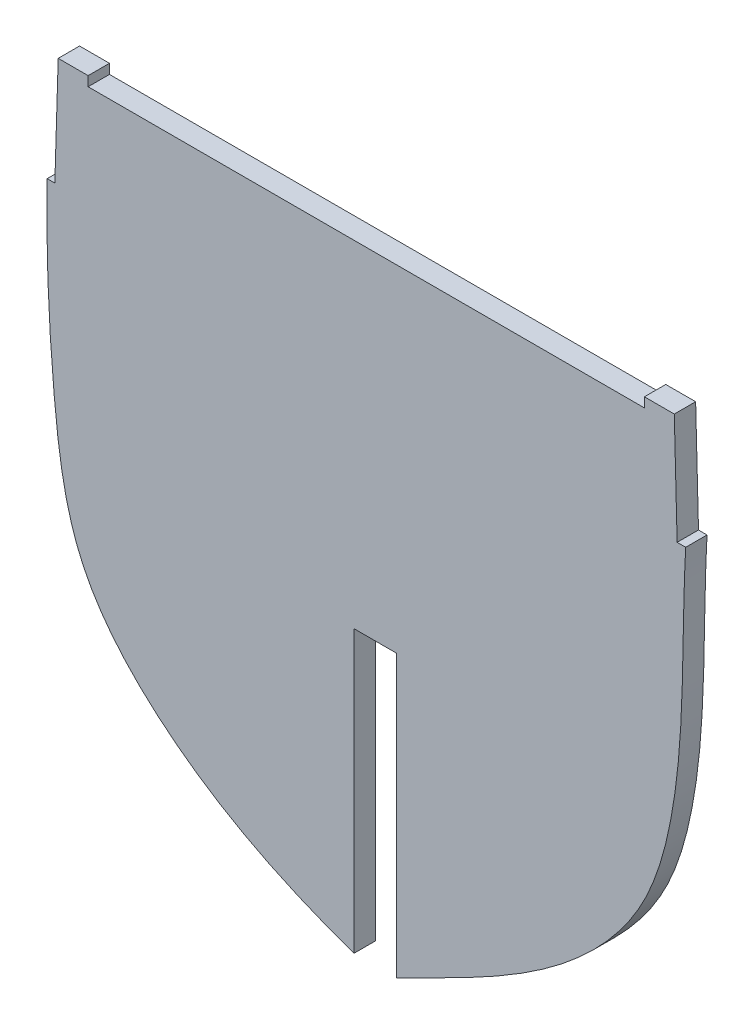
ISO-10303-21;
HEADER;
FILE_DESCRIPTION(('STEP AP214'),'2;1');
FILE_NAME('part.step','',(''),(''),'','','');
FILE_SCHEMA(('AUTOMOTIVE_DESIGN { 1 0 10303 214 1 1 1 1 }'));
ENDSEC;
DATA;
#1=APPLICATION_CONTEXT('core data for automotive mechanical design processes');
#2=APPLICATION_PROTOCOL_DEFINITION('international standard','automotive_design',2000,#1);
#3=PRODUCT_CONTEXT('',#1,'mechanical');
#4=PRODUCT('Part','Part','',(#3));
#5=PRODUCT_RELATED_PRODUCT_CATEGORY('part','',(#4));
#6=PRODUCT_DEFINITION_FORMATION('','',#4);
#7=PRODUCT_DEFINITION_CONTEXT('part definition',#1,'design');
#8=PRODUCT_DEFINITION('design','',#6,#7);
#9=PRODUCT_DEFINITION_SHAPE('','',#8);
#10=(LENGTH_UNIT() NAMED_UNIT(*) SI_UNIT(.MILLI.,.METRE.));
#11=(NAMED_UNIT(*) PLANE_ANGLE_UNIT() SI_UNIT($,.RADIAN.));
#12=(NAMED_UNIT(*) SI_UNIT($,.STERADIAN.) SOLID_ANGLE_UNIT());
#13=UNCERTAINTY_MEASURE_WITH_UNIT(LENGTH_MEASURE(1.E-05),#10,'distance_accuracy_value','');
#14=(GEOMETRIC_REPRESENTATION_CONTEXT(3) GLOBAL_UNCERTAINTY_ASSIGNED_CONTEXT((#13)) GLOBAL_UNIT_ASSIGNED_CONTEXT((#10,
#11,#12)) REPRESENTATION_CONTEXT('',''));
#15=CARTESIAN_POINT('',(0.,0.,0.));
#16=DIRECTION('',(0.,0.,1.));
#17=DIRECTION('',(1.,0.,0.));
#18=AXIS2_PLACEMENT_3D('',#15,#16,#17);
#19=CARTESIAN_POINT('',(24.5449599951427,177.485969068508,4.));
#20=DIRECTION('',(-1.,0.,0.));
#21=DIRECTION('',(0.,0.,1.));
#22=AXIS2_PLACEMENT_3D('',#19,#20,#21);
#23=PLANE('',#22);
#24=DIRECTION('',(0.,1.,0.));
#25=VECTOR('',#24,1.);
#26=CARTESIAN_POINT('',(24.5449599951427,177.485969068508,0.));
#27=LINE('',#26,#25);
#28=CARTESIAN_POINT('',(24.5449599951427,177.485969068508,0.));
#29=VERTEX_POINT('',#28);
#30=CARTESIAN_POINT('',(24.5449599951427,179.293294418819,0.));
#31=VERTEX_POINT('',#30);
#32=EDGE_CURVE('E173',#29,#31,#27,.T.);
#33=ORIENTED_EDGE('',*,*,#32,.T.);
#34=DIRECTION('',(0.,0.,-1.));
#35=VECTOR('',#34,1.);
#36=CARTESIAN_POINT('',(24.5449599951427,179.293294418819,4.));
#37=LINE('',#36,#35);
#38=CARTESIAN_POINT('',(24.5449599951427,179.293294418819,4.));
#39=VERTEX_POINT('',#38);
#40=EDGE_CURVE('E11',#39,#31,#37,.T.);
#41=ORIENTED_EDGE('',*,*,#40,.F.);
#42=DIRECTION('',(0.,1.,0.));
#43=VECTOR('',#42,1.);
#44=CARTESIAN_POINT('',(24.5449599951427,177.485969068508,4.));
#45=LINE('',#44,#43);
#46=CARTESIAN_POINT('',(24.5449599951427,177.485969068508,4.));
#47=VERTEX_POINT('',#46);
#48=EDGE_CURVE('E209',#47,#39,#45,.T.);
#49=ORIENTED_EDGE('',*,*,#48,.F.);
#50=DIRECTION('',(0.,0.,-1.));
#51=VECTOR('',#50,1.);
#52=CARTESIAN_POINT('',(24.5449599951427,177.485969068508,4.));
#53=LINE('',#52,#51);
#54=EDGE_CURVE('E169',#47,#29,#53,.T.);
#55=ORIENTED_EDGE('',*,*,#54,.T.);
#56=EDGE_LOOP('',(#33,#41,#49,#55));
#57=FACE_BOUND('',#56,.T.);
#58=ADVANCED_FACE('F41',(#57),#23,.F.);
#59=CARTESIAN_POINT('',(24.5449599951427,179.293294418819,4.));
#60=DIRECTION('',(0.,-1.,0.));
#61=DIRECTION('',(0.,0.,-1.));
#62=AXIS2_PLACEMENT_3D('',#59,#60,#61);
#63=PLANE('',#62);
#64=DIRECTION('',(-1.,0.,0.));
#65=VECTOR('',#64,1.);
#66=CARTESIAN_POINT('',(24.5449599951427,179.293294418819,0.));
#67=LINE('',#66,#65);
#68=CARTESIAN_POINT('',(18.9383360078071,179.293294418819,0.));
#69=VERTEX_POINT('',#68);
#70=EDGE_CURVE('E176',#31,#69,#67,.T.);
#71=ORIENTED_EDGE('',*,*,#70,.T.);
#72=DIRECTION('',(0.,0.,-1.));
#73=VECTOR('',#72,1.);
#74=CARTESIAN_POINT('',(18.9383360078071,179.293294418819,4.));
#75=LINE('',#74,#73);
#76=CARTESIAN_POINT('',(18.9383360078071,179.293294418819,4.));
#77=VERTEX_POINT('',#76);
#78=EDGE_CURVE('E49',#77,#69,#75,.T.);
#79=ORIENTED_EDGE('',*,*,#78,.F.);
#80=DIRECTION('',(-1.,0.,0.));
#81=VECTOR('',#80,1.);
#82=CARTESIAN_POINT('',(24.5449599951427,179.293294418819,4.));
#83=LINE('',#82,#81);
#84=EDGE_CURVE('E118',#39,#77,#83,.T.);
#85=ORIENTED_EDGE('',*,*,#84,.F.);
#86=ORIENTED_EDGE('',*,*,#40,.T.);
#87=EDGE_LOOP('',(#71,#79,#85,#86));
#88=FACE_BOUND('',#87,.T.);
#89=ADVANCED_FACE('F282',(#88),#63,.F.);
#90=CARTESIAN_POINT('',(18.9383360078071,179.293294418819,4.));
#91=DIRECTION('',(0.999533514989989,-0.0305409955921135,0.));
#92=DIRECTION('',(0.0305409955921135,0.999533514989989,0.));
#93=AXIS2_PLACEMENT_3D('',#90,#91,#92);
#94=PLANE('',#93);
#95=DIRECTION('',(-0.0305409955921135,-0.999533514989989,0.));
#96=VECTOR('',#95,1.);
#97=CARTESIAN_POINT('',(18.9383360078071,179.293294418819,0.));
#98=LINE('',#97,#96);
#99=CARTESIAN_POINT('',(18.3105079076974,158.74598692128,0.));
#100=VERTEX_POINT('',#99);
#101=EDGE_CURVE('E178',#69,#100,#98,.T.);
#102=ORIENTED_EDGE('',*,*,#101,.T.);
#103=DIRECTION('',(0.,0.,-1.));
#104=VECTOR('',#103,1.);
#105=CARTESIAN_POINT('',(18.3105079076974,158.74598692128,4.));
#106=LINE('',#105,#104);
#107=CARTESIAN_POINT('',(18.3105079076974,158.74598692128,4.));
#108=VERTEX_POINT('',#107);
#109=EDGE_CURVE('E234',#108,#100,#106,.T.);
#110=ORIENTED_EDGE('',*,*,#109,.F.);
#111=DIRECTION('',(-0.0305409955921135,-0.999533514989989,0.));
#112=VECTOR('',#111,1.);
#113=CARTESIAN_POINT('',(18.9383360078071,179.293294418819,4.));
#114=LINE('',#113,#112);
#115=EDGE_CURVE('E242',#77,#108,#114,.T.);
#116=ORIENTED_EDGE('',*,*,#115,.F.);
#117=ORIENTED_EDGE('',*,*,#78,.T.);
#118=EDGE_LOOP('',(#102,#110,#116,#117));
#119=FACE_BOUND('',#118,.T.);
#120=ADVANCED_FACE('F240',(#119),#94,.F.);
#121=CARTESIAN_POINT('',(18.3105079076974,158.74598692128,4.));
#122=DIRECTION('',(0.,-1.,0.));
#123=DIRECTION('',(0.,0.,-1.));
#124=AXIS2_PLACEMENT_3D('',#121,#122,#123);
#125=PLANE('',#124);
#126=DIRECTION('',(-1.,0.,0.));
#127=VECTOR('',#126,1.);
#128=CARTESIAN_POINT('',(18.3105079076974,158.74598692128,0.));
#129=LINE('',#128,#127);
#130=CARTESIAN_POINT('',(16.8754722503037,158.74598692128,0.));
#131=VERTEX_POINT('',#130);
#132=EDGE_CURVE('E180',#100,#131,#129,.T.);
#133=ORIENTED_EDGE('',*,*,#132,.T.);
#134=DIRECTION('',(0.,0.,-1.));
#135=VECTOR('',#134,1.);
#136=CARTESIAN_POINT('',(16.8754722503037,158.74598692128,4.));
#137=LINE('',#136,#135);
#138=CARTESIAN_POINT('',(16.8754722503037,158.74598692128,4.));
#139=VERTEX_POINT('',#138);
#140=EDGE_CURVE('E231',#139,#131,#137,.T.);
#141=ORIENTED_EDGE('',*,*,#140,.F.);
#142=DIRECTION('',(-1.,0.,0.));
#143=VECTOR('',#142,1.);
#144=CARTESIAN_POINT('',(18.3105079076974,158.74598692128,4.));
#145=LINE('',#144,#143);
#146=EDGE_CURVE('E260',#108,#139,#145,.T.);
#147=ORIENTED_EDGE('',*,*,#146,.F.);
#148=ORIENTED_EDGE('',*,*,#109,.T.);
#149=EDGE_LOOP('',(#133,#141,#147,#148));
#150=FACE_BOUND('',#149,.T.);
#151=ADVANCED_FACE('F251',(#150),#125,.F.);
#152=CARTESIAN_POINT('',(16.8754722503037,158.74598692128,4.));
#153=CARTESIAN_POINT('',(16.6568486139895,146.616830276881,4.));
#154=CARTESIAN_POINT('',(17.4738373960507,127.058071420109,4.));
#155=CARTESIAN_POINT('',(21.2697717899273,98.6479252244269,4.));
#156=CARTESIAN_POINT('',(41.8909756177615,75.8023171210251,4.));
#157=CARTESIAN_POINT('',(61.3319564848395,66.3642436856472,4.));
#158=CARTESIAN_POINT('',(74.3393563476475,61.7995703813606,4.));
#159=B_SPLINE_CURVE_WITH_KNOTS('',3,(#152,#153,#154,#155,#156,#157,#158),.UNSPECIFIED.,.F.,.F.,
(4,1,1,1,4),(0.,0.287578733918675,0.483998215081971,0.667834250413164,1.),.UNSPECIFIED.);
#160=DIRECTION('',(0.,0.,-1.));
#161=VECTOR('',#160,1.);
#162=SURFACE_OF_LINEAR_EXTRUSION('',#159,#161);
#163=CARTESIAN_POINT('',(16.8754722503037,158.74598692128,0.));
#164=CARTESIAN_POINT('',(16.6568486139895,146.616830276881,0.));
#165=CARTESIAN_POINT('',(17.4738373960507,127.058071420109,0.));
#166=CARTESIAN_POINT('',(21.2697717899273,98.6479252244269,0.));
#167=CARTESIAN_POINT('',(41.8909756177615,75.8023171210251,0.));
#168=CARTESIAN_POINT('',(61.3319564848395,66.3642436856472,0.));
#169=CARTESIAN_POINT('',(74.3393563476475,61.7995703813606,0.));
#170=B_SPLINE_CURVE_WITH_KNOTS('',3,(#163,#164,#165,#166,#167,#168,#169),.UNSPECIFIED.,.F.,.F.,
(4,1,1,1,4),(0.,0.287578733918675,0.483998215081971,0.667834250413164,1.),.UNSPECIFIED.);
#171=CARTESIAN_POINT('',(74.3393563476475,61.7995703813606,0.));
#172=VERTEX_POINT('',#171);
#173=EDGE_CURVE('E182',#131,#172,#170,.T.);
#174=ORIENTED_EDGE('',*,*,#173,.T.);
#175=DIRECTION('',(0.,0.,-1.));
#176=VECTOR('',#175,1.);
#177=CARTESIAN_POINT('',(74.3393563476475,61.7995703813606,4.));
#178=LINE('',#177,#176);
#179=CARTESIAN_POINT('',(74.3393563476475,61.7995703813606,4.));
#180=VERTEX_POINT('',#179);
#181=EDGE_CURVE('E228',#180,#172,#178,.T.);
#182=ORIENTED_EDGE('',*,*,#181,.F.);
#183=EDGE_CURVE('E257',#139,#180,#159,.T.);
#184=ORIENTED_EDGE('',*,*,#183,.F.);
#185=ORIENTED_EDGE('',*,*,#140,.T.);
#186=EDGE_LOOP('',(#174,#182,#184,#185));
#187=FACE_BOUND('',#186,.T.);
#188=ADVANCED_FACE('F255',(#187),#162,.F.);
#189=CARTESIAN_POINT('',(74.3393563476475,61.7995703813606,4.));
#190=DIRECTION('',(-1.,0.,0.));
#191=DIRECTION('',(0.,0.,1.));
#192=AXIS2_PLACEMENT_3D('',#189,#190,#191);
#193=PLANE('',#192);
#194=DIRECTION('',(0.,1.,0.));
#195=VECTOR('',#194,1.);
#196=CARTESIAN_POINT('',(74.3393563476475,61.7995703813606,0.));
#197=LINE('',#196,#195);
#198=CARTESIAN_POINT('',(74.3393563476475,114.477905509408,0.));
#199=VERTEX_POINT('',#198);
#200=EDGE_CURVE('E186',#172,#199,#197,.T.);
#201=ORIENTED_EDGE('',*,*,#200,.T.);
#202=DIRECTION('',(0.,0.,-1.));
#203=VECTOR('',#202,1.);
#204=CARTESIAN_POINT('',(74.3393563476475,114.477905509408,4.));
#205=LINE('',#204,#203);
#206=CARTESIAN_POINT('',(74.3393563476475,114.477905509408,4.));
#207=VERTEX_POINT('',#206);
#208=EDGE_CURVE('E225',#207,#199,#205,.T.);
#209=ORIENTED_EDGE('',*,*,#208,.F.);
#210=DIRECTION('',(0.,1.,0.));
#211=VECTOR('',#210,1.);
#212=CARTESIAN_POINT('',(74.3393563476475,61.7995703813606,4.));
#213=LINE('',#212,#211);
#214=EDGE_CURVE('E259',#180,#207,#213,.T.);
#215=ORIENTED_EDGE('',*,*,#214,.F.);
#216=ORIENTED_EDGE('',*,*,#181,.T.);
#217=EDGE_LOOP('',(#201,#209,#215,#216));
#218=FACE_BOUND('',#217,.T.);
#219=ADVANCED_FACE('F277',(#218),#193,.F.);
#220=CARTESIAN_POINT('',(74.3393563476475,114.477905509408,4.));
#221=DIRECTION('',(0.,1.,0.));
#222=DIRECTION('',(0.,0.,1.));
#223=AXIS2_PLACEMENT_3D('',#220,#221,#222);
#224=PLANE('',#223);
#225=DIRECTION('',(1.,0.,0.));
#226=VECTOR('',#225,1.);
#227=CARTESIAN_POINT('',(74.3393563476475,114.477905509408,0.));
#228=LINE('',#227,#226);
#229=CARTESIAN_POINT('',(82.3392226238303,114.477905509408,0.));
#230=VERTEX_POINT('',#229);
#231=EDGE_CURVE('E191',#199,#230,#228,.T.);
#232=ORIENTED_EDGE('',*,*,#231,.T.);
#233=DIRECTION('',(0.,0.,-1.));
#234=VECTOR('',#233,1.);
#235=CARTESIAN_POINT('',(82.3392226238303,114.477905509408,4.));
#236=LINE('',#235,#234);
#237=CARTESIAN_POINT('',(82.3392226238303,114.477905509408,4.));
#238=VERTEX_POINT('',#237);
#239=EDGE_CURVE('E222',#238,#230,#236,.T.);
#240=ORIENTED_EDGE('',*,*,#239,.F.);
#241=DIRECTION('',(1.,0.,0.));
#242=VECTOR('',#241,1.);
#243=CARTESIAN_POINT('',(74.3393563476475,114.477905509408,4.));
#244=LINE('',#243,#242);
#245=EDGE_CURVE('E262',#207,#238,#244,.T.);
#246=ORIENTED_EDGE('',*,*,#245,.F.);
#247=ORIENTED_EDGE('',*,*,#208,.T.);
#248=EDGE_LOOP('',(#232,#240,#246,#247));
#249=FACE_BOUND('',#248,.T.);
#250=ADVANCED_FACE('F315',(#249),#224,.F.);
#251=CARTESIAN_POINT('',(82.3392226238303,114.477905509408,4.));
#252=DIRECTION('',(1.,0.,0.));
#253=DIRECTION('',(0.,0.,-1.));
#254=AXIS2_PLACEMENT_3D('',#251,#252,#253);
#255=PLANE('',#254);
#256=DIRECTION('',(0.,-1.,0.));
#257=VECTOR('',#256,1.);
#258=CARTESIAN_POINT('',(82.3392226238303,114.477905509408,0.));
#259=LINE('',#258,#257);
#260=CARTESIAN_POINT('',(82.3392226238303,61.7995703813606,0.));
#261=VERTEX_POINT('',#260);
#262=EDGE_CURVE('E193',#230,#261,#259,.T.);
#263=ORIENTED_EDGE('',*,*,#262,.T.);
#264=DIRECTION('',(0.,0.,-1.));
#265=VECTOR('',#264,1.);
#266=CARTESIAN_POINT('',(82.3392226238303,61.7995703813606,4.));
#267=LINE('',#266,#265);
#268=CARTESIAN_POINT('',(82.3392226238303,61.7995703813606,4.));
#269=VERTEX_POINT('',#268);
#270=EDGE_CURVE('E219',#269,#261,#267,.T.);
#271=ORIENTED_EDGE('',*,*,#270,.F.);
#272=DIRECTION('',(0.,-1.,0.));
#273=VECTOR('',#272,1.);
#274=CARTESIAN_POINT('',(82.3392226238303,114.477905509408,4.));
#275=LINE('',#274,#273);
#276=EDGE_CURVE('E312',#238,#269,#275,.T.);
#277=ORIENTED_EDGE('',*,*,#276,.F.);
#278=ORIENTED_EDGE('',*,*,#239,.T.);
#279=EDGE_LOOP('',(#263,#271,#277,#278));
#280=FACE_BOUND('',#279,.T.);
#281=ADVANCED_FACE('F309',(#280),#255,.F.);
#282=CARTESIAN_POINT('',(82.3392226238303,61.7995703813606,4.));
#283=CARTESIAN_POINT('',(93.413791621102,67.4010847202078,4.));
#284=CARTESIAN_POINT('',(111.733151170854,75.7212902641461,4.));
#285=CARTESIAN_POINT('',(128.944446456415,95.0470857930161,4.));
#286=CARTESIAN_POINT('',(136.913830683501,122.368393715105,4.));
#287=CARTESIAN_POINT('',(135.61295932846,143.308632698288,4.));
#288=CARTESIAN_POINT('',(136.480161375376,158.74598692128,4.));
#289=B_SPLINE_CURVE_WITH_KNOTS('',3,(#282,#283,#284,#285,#286,#287,#288),.UNSPECIFIED.,.F.,.F.,
(4,1,1,1,4),(0.,0.307761120957526,0.490249999642323,0.616329843345038,1.),.UNSPECIFIED.);
#290=DIRECTION('',(0.,0.,-1.));
#291=VECTOR('',#290,1.);
#292=SURFACE_OF_LINEAR_EXTRUSION('',#289,#291);
#293=CARTESIAN_POINT('',(82.3392226238303,61.7995703813606,0.));
#294=CARTESIAN_POINT('',(93.413791621102,67.4010847202078,0.));
#295=CARTESIAN_POINT('',(111.733151170854,75.7212902641461,0.));
#296=CARTESIAN_POINT('',(128.944446456415,95.0470857930161,0.));
#297=CARTESIAN_POINT('',(136.913830683501,122.368393715105,0.));
#298=CARTESIAN_POINT('',(135.61295932846,143.308632698288,0.));
#299=CARTESIAN_POINT('',(136.480161375376,158.74598692128,0.));
#300=B_SPLINE_CURVE_WITH_KNOTS('',3,(#293,#294,#295,#296,#297,#298,#299),.UNSPECIFIED.,.F.,.F.,
(4,1,1,1,4),(0.,0.307761120957526,0.490249999642323,0.616329843345038,1.),.UNSPECIFIED.);
#301=CARTESIAN_POINT('',(136.480161375376,158.74598692128,0.));
#302=VERTEX_POINT('',#301);
#303=EDGE_CURVE('E195',#261,#302,#300,.T.);
#304=ORIENTED_EDGE('',*,*,#303,.T.);
#305=DIRECTION('',(0.,0.,-1.));
#306=VECTOR('',#305,1.);
#307=CARTESIAN_POINT('',(136.480161375376,158.74598692128,4.));
#308=LINE('',#307,#306);
#309=CARTESIAN_POINT('',(136.480161375376,158.74598692128,4.));
#310=VERTEX_POINT('',#309);
#311=EDGE_CURVE('E216',#310,#302,#308,.T.);
#312=ORIENTED_EDGE('',*,*,#311,.F.);
#313=EDGE_CURVE('E304',#269,#310,#289,.T.);
#314=ORIENTED_EDGE('',*,*,#313,.F.);
#315=ORIENTED_EDGE('',*,*,#270,.T.);
#316=EDGE_LOOP('',(#304,#312,#314,#315));
#317=FACE_BOUND('',#316,.T.);
#318=ADVANCED_FACE('F303',(#317),#292,.F.);
#319=CARTESIAN_POINT('',(134.879857933375,158.74598692128,4.));
#320=DIRECTION('',(0.,-1.,0.));
#321=DIRECTION('',(0.,0.,-1.));
#322=AXIS2_PLACEMENT_3D('',#319,#320,#321);
#323=PLANE('',#322);
#324=DIRECTION('',(-1.,0.,0.));
#325=VECTOR('',#324,1.);
#326=CARTESIAN_POINT('',(134.879857933375,158.74598692128,0.));
#327=LINE('',#326,#325);
#328=CARTESIAN_POINT('',(134.879857933375,158.74598692128,0.));
#329=VERTEX_POINT('',#328);
#330=EDGE_CURVE('E199',#302,#329,#327,.T.);
#331=ORIENTED_EDGE('',*,*,#330,.T.);
#332=DIRECTION('',(0.,0.,-1.));
#333=VECTOR('',#332,1.);
#334=CARTESIAN_POINT('',(134.879857933375,158.74598692128,4.));
#335=LINE('',#334,#333);
#336=CARTESIAN_POINT('',(134.879857933375,158.74598692128,4.));
#337=VERTEX_POINT('',#336);
#338=EDGE_CURVE('E213',#337,#329,#335,.T.);
#339=ORIENTED_EDGE('',*,*,#338,.F.);
#340=DIRECTION('',(-1.,0.,0.));
#341=VECTOR('',#340,1.);
#342=CARTESIAN_POINT('',(134.879857933375,158.74598692128,4.));
#343=LINE('',#342,#341);
#344=EDGE_CURVE('E299',#310,#337,#343,.T.);
#345=ORIENTED_EDGE('',*,*,#344,.F.);
#346=ORIENTED_EDGE('',*,*,#311,.T.);
#347=EDGE_LOOP('',(#331,#339,#345,#346));
#348=FACE_BOUND('',#347,.T.);
#349=ADVANCED_FACE('F298',(#348),#323,.F.);
#350=CARTESIAN_POINT('',(134.346034297974,179.293294418819,4.));
#351=DIRECTION('',(-0.999662684749823,-0.0259714596966876,0.));
#352=DIRECTION('',(0.0259714596966876,-0.999662684749823,0.));
#353=AXIS2_PLACEMENT_3D('',#350,#351,#352);
#354=PLANE('',#353);
#355=DIRECTION('',(-0.0259714596966876,0.999662684749823,0.));
#356=VECTOR('',#355,1.);
#357=CARTESIAN_POINT('',(134.346034297974,179.293294418819,0.));
#358=LINE('',#357,#356);
#359=CARTESIAN_POINT('',(134.346034297974,179.293294418819,0.));
#360=VERTEX_POINT('',#359);
#361=EDGE_CURVE('E204',#329,#360,#358,.T.);
#362=ORIENTED_EDGE('',*,*,#361,.T.);
#363=DIRECTION('',(0.,0.,-1.));
#364=VECTOR('',#363,1.);
#365=CARTESIAN_POINT('',(134.346034297974,179.293294418819,4.));
#366=LINE('',#365,#364);
#367=CARTESIAN_POINT('',(134.346034297974,179.293294418819,4.));
#368=VERTEX_POINT('',#367);
#369=EDGE_CURVE('E164',#368,#360,#366,.T.);
#370=ORIENTED_EDGE('',*,*,#369,.F.);
#371=DIRECTION('',(-0.0259714596966876,0.999662684749823,0.));
#372=VECTOR('',#371,1.);
#373=CARTESIAN_POINT('',(134.346034297974,179.293294418819,4.));
#374=LINE('',#373,#372);
#375=EDGE_CURVE('E155',#337,#368,#374,.T.);
#376=ORIENTED_EDGE('',*,*,#375,.F.);
#377=ORIENTED_EDGE('',*,*,#338,.T.);
#378=EDGE_LOOP('',(#362,#370,#376,#377));
#379=FACE_BOUND('',#378,.T.);
#380=ADVANCED_FACE('F294',(#379),#354,.F.);
#381=CARTESIAN_POINT('',(128.748328157876,179.293294418819,4.));
#382=DIRECTION('',(0.,-1.,0.));
#383=DIRECTION('',(0.,0.,-1.));
#384=AXIS2_PLACEMENT_3D('',#381,#382,#383);
#385=PLANE('',#384);
#386=DIRECTION('',(-1.,0.,0.));
#387=VECTOR('',#386,1.);
#388=CARTESIAN_POINT('',(128.748328157876,179.293294418819,0.));
#389=LINE('',#388,#387);
#390=CARTESIAN_POINT('',(128.748328157876,179.293294418819,0.));
#391=VERTEX_POINT('',#390);
#392=EDGE_CURVE('E163',#360,#391,#389,.T.);
#393=ORIENTED_EDGE('',*,*,#392,.T.);
#394=DIRECTION('',(0.,0.,-1.));
#395=VECTOR('',#394,1.);
#396=CARTESIAN_POINT('',(128.748328157876,179.293294418819,4.));
#397=LINE('',#396,#395);
#398=CARTESIAN_POINT('',(128.748328157876,179.293294418819,4.));
#399=VERTEX_POINT('',#398);
#400=EDGE_CURVE('E160',#399,#391,#397,.T.);
#401=ORIENTED_EDGE('',*,*,#400,.F.);
#402=DIRECTION('',(-1.,0.,0.));
#403=VECTOR('',#402,1.);
#404=CARTESIAN_POINT('',(128.748328157876,179.293294418819,4.));
#405=LINE('',#404,#403);
#406=EDGE_CURVE('E149',#368,#399,#405,.T.);
#407=ORIENTED_EDGE('',*,*,#406,.F.);
#408=ORIENTED_EDGE('',*,*,#369,.T.);
#409=EDGE_LOOP('',(#393,#401,#407,#408));
#410=FACE_BOUND('',#409,.T.);
#411=ADVANCED_FACE('F161',(#410),#385,.F.);
#412=CARTESIAN_POINT('',(128.748328157876,177.485969068508,4.));
#413=DIRECTION('',(1.,0.,0.));
#414=DIRECTION('',(0.,1.,0.));
#415=AXIS2_PLACEMENT_3D('',#412,#413,#414);
#416=PLANE('',#415);
#417=DIRECTION('',(0.,-1.,0.));
#418=VECTOR('',#417,1.);
#419=CARTESIAN_POINT('',(128.748328157876,177.485969068508,0.));
#420=LINE('',#419,#418);
#421=CARTESIAN_POINT('',(128.748328157876,177.485969068508,0.));
#422=VERTEX_POINT('',#421);
#423=EDGE_CURVE('E104',#391,#422,#420,.T.);
#424=ORIENTED_EDGE('',*,*,#423,.T.);
#425=DIRECTION('',(0.,0.,-1.));
#426=VECTOR('',#425,1.);
#427=CARTESIAN_POINT('',(128.748328157876,177.485969068508,4.));
#428=LINE('',#427,#426);
#429=CARTESIAN_POINT('',(128.748328157876,177.485969068508,4.));
#430=VERTEX_POINT('',#429);
#431=EDGE_CURVE('E165',#430,#422,#428,.T.);
#432=ORIENTED_EDGE('',*,*,#431,.F.);
#433=DIRECTION('',(0.,-1.,0.));
#434=VECTOR('',#433,1.);
#435=CARTESIAN_POINT('',(128.748328157876,177.485969068508,4.));
#436=LINE('',#435,#434);
#437=EDGE_CURVE('E153',#399,#430,#436,.T.);
#438=ORIENTED_EDGE('',*,*,#437,.F.);
#439=ORIENTED_EDGE('',*,*,#400,.T.);
#440=EDGE_LOOP('',(#424,#432,#438,#439));
#441=FACE_BOUND('',#440,.T.);
#442=ADVANCED_FACE('F167',(#441),#416,.F.);
#443=CARTESIAN_POINT('',(24.5449599951427,177.485969068508,4.));
#444=DIRECTION('',(0.,-1.,0.));
#445=DIRECTION('',(0.,0.,-1.));
#446=AXIS2_PLACEMENT_3D('',#443,#444,#445);
#447=PLANE('',#446);
#448=DIRECTION('',(-1.,0.,0.));
#449=VECTOR('',#448,1.);
#450=CARTESIAN_POINT('',(24.5449599951427,177.485969068508,0.));
#451=LINE('',#450,#449);
#452=EDGE_CURVE('E110',#422,#29,#451,.T.);
#453=ORIENTED_EDGE('',*,*,#452,.T.);
#454=ORIENTED_EDGE('',*,*,#54,.F.);
#455=DIRECTION('',(-1.,0.,0.));
#456=VECTOR('',#455,1.);
#457=CARTESIAN_POINT('',(24.5449599951427,177.485969068508,4.));
#458=LINE('',#457,#456);
#459=EDGE_CURVE('E57',#430,#47,#458,.T.);
#460=ORIENTED_EDGE('',*,*,#459,.F.);
#461=ORIENTED_EDGE('',*,*,#431,.T.);
#462=EDGE_LOOP('',(#453,#454,#460,#461));
#463=FACE_BOUND('',#462,.T.);
#464=ADVANCED_FACE('F409',(#463),#447,.F.);
#465=CARTESIAN_POINT('',(24.5970537389648,97.4138792286707,4.));
#466=DIRECTION('',(0.,0.,-1.));
#467=DIRECTION('',(-1.,0.,0.));
#468=AXIS2_PLACEMENT_3D('',#465,#466,#467);
#469=PLANE('',#468);
#470=ORIENTED_EDGE('',*,*,#48,.T.);
#471=ORIENTED_EDGE('',*,*,#84,.T.);
#472=ORIENTED_EDGE('',*,*,#115,.T.);
#473=ORIENTED_EDGE('',*,*,#146,.T.);
#474=ORIENTED_EDGE('',*,*,#183,.T.);
#475=ORIENTED_EDGE('',*,*,#214,.T.);
#476=ORIENTED_EDGE('',*,*,#245,.T.);
#477=ORIENTED_EDGE('',*,*,#276,.T.);
#478=ORIENTED_EDGE('',*,*,#313,.T.);
#479=ORIENTED_EDGE('',*,*,#344,.T.);
#480=ORIENTED_EDGE('',*,*,#375,.T.);
#481=ORIENTED_EDGE('',*,*,#406,.T.);
#482=ORIENTED_EDGE('',*,*,#437,.T.);
#483=ORIENTED_EDGE('',*,*,#459,.T.);
#484=EDGE_LOOP('',(#470,#471,#472,#473,#474,#475,#476,#477,#478,#479,#480,#481,#482,#483));
#485=FACE_BOUND('',#484,.T.);
#486=ADVANCED_FACE('F151',(#485),#469,.F.);
#487=CARTESIAN_POINT('',(24.5970537389648,97.4138792286707,0.));
#488=DIRECTION('',(0.,0.,-1.));
#489=DIRECTION('',(-1.,0.,0.));
#490=AXIS2_PLACEMENT_3D('',#487,#488,#489);
#491=PLANE('',#490);
#492=ORIENTED_EDGE('',*,*,#32,.F.);
#493=ORIENTED_EDGE('',*,*,#452,.F.);
#494=ORIENTED_EDGE('',*,*,#423,.F.);
#495=ORIENTED_EDGE('',*,*,#392,.F.);
#496=ORIENTED_EDGE('',*,*,#361,.F.);
#497=ORIENTED_EDGE('',*,*,#330,.F.);
#498=ORIENTED_EDGE('',*,*,#303,.F.);
#499=ORIENTED_EDGE('',*,*,#262,.F.);
#500=ORIENTED_EDGE('',*,*,#231,.F.);
#501=ORIENTED_EDGE('',*,*,#200,.F.);
#502=ORIENTED_EDGE('',*,*,#173,.F.);
#503=ORIENTED_EDGE('',*,*,#132,.F.);
#504=ORIENTED_EDGE('',*,*,#101,.F.);
#505=ORIENTED_EDGE('',*,*,#70,.F.);
#506=EDGE_LOOP('',(#492,#493,#494,#495,#496,#497,#498,#499,#500,#501,#502,#503,#504,#505));
#507=FACE_BOUND('',#506,.T.);
#508=ADVANCED_FACE('F246',(#507),#491,.T.);
#509=CLOSED_SHELL('',(#58,#89,#120,#151,#188,#219,#250,#281,#318,#349,#380,#411,#442,#464,#486,#508));
#510=MANIFOLD_SOLID_BREP('B2',#509);
#511=ADVANCED_BREP_SHAPE_REPRESENTATION('',(#18,#510),#14);
#512=SHAPE_DEFINITION_REPRESENTATION(#9,#511);
ENDSEC;
END-ISO-10303-21;
